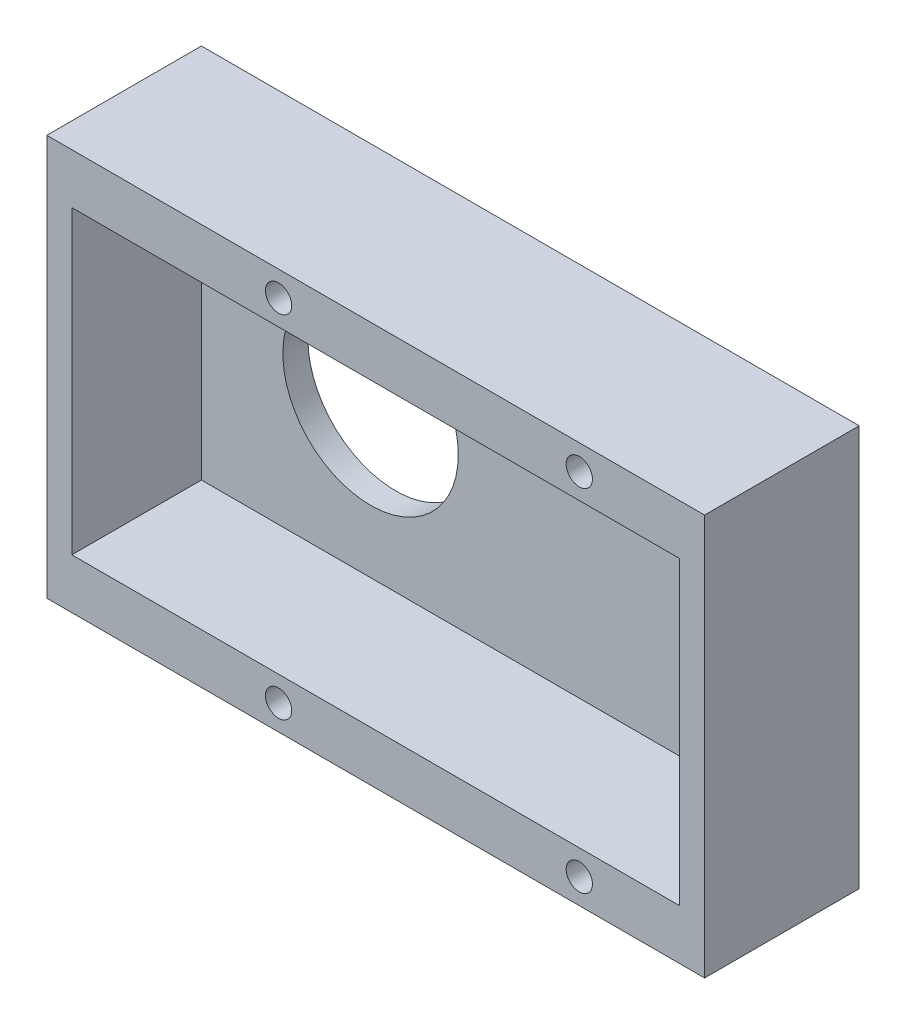
ISO-10303-21;
HEADER;
FILE_DESCRIPTION(('STEP AP214'),'2;1');
FILE_NAME('part.step','',(''),(''),'','','');
FILE_SCHEMA(('AUTOMOTIVE_DESIGN { 1 0 10303 214 1 1 1 1 }'));
ENDSEC;
DATA;
#1=APPLICATION_CONTEXT('core data for automotive mechanical design processes');
#2=APPLICATION_PROTOCOL_DEFINITION('international standard','automotive_design',2000,#1);
#3=PRODUCT_CONTEXT('',#1,'mechanical');
#4=PRODUCT('Part','Part','',(#3));
#5=PRODUCT_RELATED_PRODUCT_CATEGORY('part','',(#4));
#6=PRODUCT_DEFINITION_FORMATION('','',#4);
#7=PRODUCT_DEFINITION_CONTEXT('part definition',#1,'design');
#8=PRODUCT_DEFINITION('design','',#6,#7);
#9=PRODUCT_DEFINITION_SHAPE('','',#8);
#10=(LENGTH_UNIT() NAMED_UNIT(*) SI_UNIT(.MILLI.,.METRE.));
#11=(NAMED_UNIT(*) PLANE_ANGLE_UNIT() SI_UNIT($,.RADIAN.));
#12=(NAMED_UNIT(*) SI_UNIT($,.STERADIAN.) SOLID_ANGLE_UNIT());
#13=UNCERTAINTY_MEASURE_WITH_UNIT(LENGTH_MEASURE(1.E-05),#10,'distance_accuracy_value','');
#14=(GEOMETRIC_REPRESENTATION_CONTEXT(3) GLOBAL_UNCERTAINTY_ASSIGNED_CONTEXT((#13)) GLOBAL_UNIT_ASSIGNED_CONTEXT((#10,
#11,#12)) REPRESENTATION_CONTEXT('',''));
#15=CARTESIAN_POINT('',(0.,0.,0.));
#16=DIRECTION('',(0.,0.,1.));
#17=DIRECTION('',(1.,0.,0.));
#18=AXIS2_PLACEMENT_3D('',#15,#16,#17);
#19=CARTESIAN_POINT('',(0.,0.,2.));
#20=DIRECTION('',(1.,0.,0.));
#21=DIRECTION('',(0.,1.,0.));
#22=AXIS2_PLACEMENT_3D('',#19,#20,#21);
#23=PLANE('',#22);
#24=DIRECTION('',(0.,-1.,0.));
#25=VECTOR('',#24,1.);
#26=CARTESIAN_POINT('',(0.,0.,0.));
#27=LINE('',#26,#25);
#28=CARTESIAN_POINT('',(0.,32.,0.));
#29=VERTEX_POINT('',#28);
#30=CARTESIAN_POINT('',(0.,0.,0.));
#31=VERTEX_POINT('',#30);
#32=EDGE_CURVE('E158',#29,#31,#27,.T.);
#33=ORIENTED_EDGE('',*,*,#32,.T.);
#34=DIRECTION('',(0.,0.,-1.));
#35=VECTOR('',#34,1.);
#36=CARTESIAN_POINT('',(0.,0.,2.));
#37=LINE('',#36,#35);
#38=CARTESIAN_POINT('',(0.,0.,12.34));
#39=VERTEX_POINT('',#38);
#40=EDGE_CURVE('E11',#39,#31,#37,.T.);
#41=ORIENTED_EDGE('',*,*,#40,.F.);
#42=DIRECTION('',(0.,-1.,0.));
#43=VECTOR('',#42,1.);
#44=CARTESIAN_POINT('',(0.,32.,12.34));
#45=LINE('',#44,#43);
#46=CARTESIAN_POINT('',(0.,32.,12.34));
#47=VERTEX_POINT('',#46);
#48=EDGE_CURVE('E121',#47,#39,#45,.T.);
#49=ORIENTED_EDGE('',*,*,#48,.F.);
#50=DIRECTION('',(0.,0.,-1.));
#51=VECTOR('',#50,1.);
#52=CARTESIAN_POINT('',(0.,32.,2.));
#53=LINE('',#52,#51);
#54=EDGE_CURVE('E166',#47,#29,#53,.T.);
#55=ORIENTED_EDGE('',*,*,#54,.T.);
#56=EDGE_LOOP('',(#33,#41,#49,#55));
#57=FACE_BOUND('',#56,.T.);
#58=ADVANCED_FACE('F39',(#57),#23,.F.);
#59=CARTESIAN_POINT('',(0.,0.,2.));
#60=DIRECTION('',(0.,1.,0.));
#61=DIRECTION('',(0.,0.,1.));
#62=AXIS2_PLACEMENT_3D('',#59,#60,#61);
#63=PLANE('',#62);
#64=DIRECTION('',(1.,0.,0.));
#65=VECTOR('',#64,1.);
#66=CARTESIAN_POINT('',(0.,0.,0.));
#67=LINE('',#66,#65);
#68=CARTESIAN_POINT('',(52.5,0.,0.));
#69=VERTEX_POINT('',#68);
#70=EDGE_CURVE('E161',#31,#69,#67,.T.);
#71=ORIENTED_EDGE('',*,*,#70,.T.);
#72=DIRECTION('',(0.,0.,-1.));
#73=VECTOR('',#72,1.);
#74=CARTESIAN_POINT('',(52.5,0.,2.));
#75=LINE('',#74,#73);
#76=CARTESIAN_POINT('',(52.5,0.,12.34));
#77=VERTEX_POINT('',#76);
#78=EDGE_CURVE('E46',#77,#69,#75,.T.);
#79=ORIENTED_EDGE('',*,*,#78,.F.);
#80=DIRECTION('',(1.,0.,0.));
#81=VECTOR('',#80,1.);
#82=CARTESIAN_POINT('',(0.,0.,12.34));
#83=LINE('',#82,#81);
#84=EDGE_CURVE('E149',#39,#77,#83,.T.);
#85=ORIENTED_EDGE('',*,*,#84,.F.);
#86=ORIENTED_EDGE('',*,*,#40,.T.);
#87=EDGE_LOOP('',(#71,#79,#85,#86));
#88=FACE_BOUND('',#87,.T.);
#89=ADVANCED_FACE('F184',(#88),#63,.F.);
#90=CARTESIAN_POINT('',(52.5,0.,2.));
#91=DIRECTION('',(-1.,0.,0.));
#92=DIRECTION('',(0.,-1.,0.));
#93=AXIS2_PLACEMENT_3D('',#90,#91,#92);
#94=PLANE('',#93);
#95=DIRECTION('',(0.,1.,0.));
#96=VECTOR('',#95,1.);
#97=CARTESIAN_POINT('',(52.5,0.,0.));
#98=LINE('',#97,#96);
#99=CARTESIAN_POINT('',(52.5,32.,0.));
#100=VERTEX_POINT('',#99);
#101=EDGE_CURVE('E163',#69,#100,#98,.T.);
#102=ORIENTED_EDGE('',*,*,#101,.T.);
#103=DIRECTION('',(0.,0.,-1.));
#104=VECTOR('',#103,1.);
#105=CARTESIAN_POINT('',(52.5,32.,2.));
#106=LINE('',#105,#104);
#107=CARTESIAN_POINT('',(52.5,32.,12.34));
#108=VERTEX_POINT('',#107);
#109=EDGE_CURVE('E168',#108,#100,#106,.T.);
#110=ORIENTED_EDGE('',*,*,#109,.F.);
#111=DIRECTION('',(0.,1.,0.));
#112=VECTOR('',#111,1.);
#113=CARTESIAN_POINT('',(52.5,32.,12.34));
#114=LINE('',#113,#112);
#115=EDGE_CURVE('E152',#77,#108,#114,.T.);
#116=ORIENTED_EDGE('',*,*,#115,.F.);
#117=ORIENTED_EDGE('',*,*,#78,.T.);
#118=EDGE_LOOP('',(#102,#110,#116,#117));
#119=FACE_BOUND('',#118,.T.);
#120=ADVANCED_FACE('F173',(#119),#94,.F.);
#121=CARTESIAN_POINT('',(0.,32.,2.));
#122=DIRECTION('',(0.,-1.,0.));
#123=DIRECTION('',(0.,0.,-1.));
#124=AXIS2_PLACEMENT_3D('',#121,#122,#123);
#125=PLANE('',#124);
#126=DIRECTION('',(-1.,0.,0.));
#127=VECTOR('',#126,1.);
#128=CARTESIAN_POINT('',(0.,32.,0.));
#129=LINE('',#128,#127);
#130=EDGE_CURVE('E61',#100,#29,#129,.T.);
#131=ORIENTED_EDGE('',*,*,#130,.T.);
#132=ORIENTED_EDGE('',*,*,#54,.F.);
#133=DIRECTION('',(-1.,0.,0.));
#134=VECTOR('',#133,1.);
#135=CARTESIAN_POINT('',(0.,32.,12.34));
#136=LINE('',#135,#134);
#137=EDGE_CURVE('E155',#108,#47,#136,.T.);
#138=ORIENTED_EDGE('',*,*,#137,.F.);
#139=ORIENTED_EDGE('',*,*,#109,.T.);
#140=EDGE_LOOP('',(#131,#132,#138,#139));
#141=FACE_BOUND('',#140,.T.);
#142=ADVANCED_FACE('F182',(#141),#125,.F.);
#143=CARTESIAN_POINT('',(0.,0.,0.));
#144=DIRECTION('',(0.,0.,-1.));
#145=DIRECTION('',(-1.,0.,0.));
#146=AXIS2_PLACEMENT_3D('',#143,#144,#145);
#147=PLANE('',#146);
#148=CARTESIAN_POINT('',(18.5,2.,0.));
#149=DIRECTION('',(0.,0.,-1.));
#150=DIRECTION('',(-1.,0.,0.));
#151=AXIS2_PLACEMENT_3D('',#148,#149,#150);
#152=CIRCLE('',#151,1.05);
#153=CARTESIAN_POINT('',(17.45,2.,0.));
#154=VERTEX_POINT('',#153);
#155=EDGE_CURVE('E254',#154,#154,#152,.F.);
#156=ORIENTED_EDGE('',*,*,#155,.T.);
#157=EDGE_LOOP('',(#156));
#158=FACE_BOUND('',#157,.T.);
#159=CARTESIAN_POINT('',(42.5,1.99999999999999,0.));
#160=DIRECTION('',(0.,0.,-1.));
#161=DIRECTION('',(-1.,0.,0.));
#162=AXIS2_PLACEMENT_3D('',#159,#160,#161);
#163=CIRCLE('',#162,1.04999999999999);
#164=CARTESIAN_POINT('',(41.45,1.99999999999999,0.));
#165=VERTEX_POINT('',#164);
#166=EDGE_CURVE('E244',#165,#165,#163,.F.);
#167=ORIENTED_EDGE('',*,*,#166,.T.);
#168=EDGE_LOOP('',(#167));
#169=FACE_BOUND('',#168,.T.);
#170=CARTESIAN_POINT('',(42.5,30.,0.));
#171=DIRECTION('',(0.,0.,-1.));
#172=DIRECTION('',(-1.,0.,0.));
#173=AXIS2_PLACEMENT_3D('',#170,#171,#172);
#174=CIRCLE('',#173,1.04999999999999);
#175=CARTESIAN_POINT('',(41.45,30.,0.));
#176=VERTEX_POINT('',#175);
#177=EDGE_CURVE('E239',#176,#176,#174,.F.);
#178=ORIENTED_EDGE('',*,*,#177,.T.);
#179=EDGE_LOOP('',(#178));
#180=FACE_BOUND('',#179,.T.);
#181=CARTESIAN_POINT('',(18.5,30.,0.));
#182=DIRECTION('',(0.,0.,-1.));
#183=DIRECTION('',(-1.,0.,0.));
#184=AXIS2_PLACEMENT_3D('',#181,#182,#183);
#185=CIRCLE('',#184,1.05);
#186=CARTESIAN_POINT('',(17.45,30.,0.));
#187=VERTEX_POINT('',#186);
#188=EDGE_CURVE('E246',#187,#187,#185,.F.);
#189=ORIENTED_EDGE('',*,*,#188,.T.);
#190=EDGE_LOOP('',(#189));
#191=FACE_BOUND('',#190,.T.);
#192=CARTESIAN_POINT('',(15.5,16.,0.));
#193=DIRECTION('',(0.,0.,-1.));
#194=DIRECTION('',(-1.,0.,0.));
#195=AXIS2_PLACEMENT_3D('',#192,#193,#194);
#196=CIRCLE('',#195,7.00000000000001);
#197=CARTESIAN_POINT('',(8.5,16.,0.));
#198=VERTEX_POINT('',#197);
#199=EDGE_CURVE('E263',#198,#198,#196,.F.);
#200=ORIENTED_EDGE('',*,*,#199,.T.);
#201=EDGE_LOOP('',(#200));
#202=FACE_BOUND('',#201,.T.);
#203=ORIENTED_EDGE('',*,*,#32,.F.);
#204=ORIENTED_EDGE('',*,*,#130,.F.);
#205=ORIENTED_EDGE('',*,*,#101,.F.);
#206=ORIENTED_EDGE('',*,*,#70,.F.);
#207=EDGE_LOOP('',(#203,#204,#205,#206));
#208=FACE_BOUND('',#207,.T.);
#209=ADVANCED_FACE('F178',(#158,#169,#180,#191,#202,#208),#147,.T.);
#210=CARTESIAN_POINT('',(0.,0.,12.34));
#211=DIRECTION('',(0.,0.,1.));
#212=DIRECTION('',(1.,0.,0.));
#213=AXIS2_PLACEMENT_3D('',#210,#211,#212);
#214=PLANE('',#213);
#215=CARTESIAN_POINT('',(18.5,2.,12.34));
#216=DIRECTION('',(0.,0.,1.));
#217=DIRECTION('',(-1.,0.,0.));
#218=AXIS2_PLACEMENT_3D('',#215,#216,#217);
#219=CIRCLE('',#218,1.05);
#220=CARTESIAN_POINT('',(17.45,2.,12.34));
#221=VERTEX_POINT('',#220);
#222=EDGE_CURVE('E257',#221,#221,#219,.T.);
#223=ORIENTED_EDGE('',*,*,#222,.F.);
#224=EDGE_LOOP('',(#223));
#225=FACE_BOUND('',#224,.T.);
#226=CARTESIAN_POINT('',(42.5,1.99999999999999,12.34));
#227=DIRECTION('',(0.,0.,1.));
#228=DIRECTION('',(1.,0.,0.));
#229=AXIS2_PLACEMENT_3D('',#226,#227,#228);
#230=CIRCLE('',#229,1.04999999999999);
#231=CARTESIAN_POINT('',(43.55,1.99999999999999,12.34));
#232=VERTEX_POINT('',#231);
#233=EDGE_CURVE('E249',#232,#232,#230,.T.);
#234=ORIENTED_EDGE('',*,*,#233,.F.);
#235=EDGE_LOOP('',(#234));
#236=FACE_BOUND('',#235,.T.);
#237=CARTESIAN_POINT('',(42.5,30.,12.34));
#238=DIRECTION('',(0.,0.,1.));
#239=DIRECTION('',(-1.,0.,0.));
#240=AXIS2_PLACEMENT_3D('',#237,#238,#239);
#241=CIRCLE('',#240,1.04999999999999);
#242=CARTESIAN_POINT('',(41.45,30.,12.34));
#243=VERTEX_POINT('',#242);
#244=EDGE_CURVE('E242',#243,#243,#241,.T.);
#245=ORIENTED_EDGE('',*,*,#244,.F.);
#246=EDGE_LOOP('',(#245));
#247=FACE_BOUND('',#246,.T.);
#248=CARTESIAN_POINT('',(18.5,30.,12.34));
#249=DIRECTION('',(0.,0.,1.));
#250=DIRECTION('',(1.,0.,0.));
#251=AXIS2_PLACEMENT_3D('',#248,#249,#250);
#252=CIRCLE('',#251,1.05);
#253=CARTESIAN_POINT('',(19.55,30.,12.34));
#254=VERTEX_POINT('',#253);
#255=EDGE_CURVE('E260',#254,#254,#252,.T.);
#256=ORIENTED_EDGE('',*,*,#255,.F.);
#257=EDGE_LOOP('',(#256));
#258=FACE_BOUND('',#257,.T.);
#259=ORIENTED_EDGE('',*,*,#48,.T.);
#260=ORIENTED_EDGE('',*,*,#84,.T.);
#261=ORIENTED_EDGE('',*,*,#115,.T.);
#262=ORIENTED_EDGE('',*,*,#137,.T.);
#263=EDGE_LOOP('',(#259,#260,#261,#262));
#264=FACE_BOUND('',#263,.T.);
#265=DIRECTION('',(1.,0.,0.));
#266=VECTOR('',#265,1.);
#267=CARTESIAN_POINT('',(2.,4.,12.34));
#268=LINE('',#267,#266);
#269=CARTESIAN_POINT('',(2.,4.,12.34));
#270=VERTEX_POINT('',#269);
#271=CARTESIAN_POINT('',(50.5,4.,12.34));
#272=VERTEX_POINT('',#271);
#273=EDGE_CURVE('E113',#270,#272,#268,.T.);
#274=ORIENTED_EDGE('',*,*,#273,.F.);
#275=DIRECTION('',(0.,-1.,0.));
#276=VECTOR('',#275,1.);
#277=CARTESIAN_POINT('',(2.,28.,12.34));
#278=LINE('',#277,#276);
#279=CARTESIAN_POINT('',(2.,28.,12.34));
#280=VERTEX_POINT('',#279);
#281=EDGE_CURVE('E105',#280,#270,#278,.T.);
#282=ORIENTED_EDGE('',*,*,#281,.F.);
#283=DIRECTION('',(-1.,0.,0.));
#284=VECTOR('',#283,1.);
#285=CARTESIAN_POINT('',(2.,28.,12.34));
#286=LINE('',#285,#284);
#287=CARTESIAN_POINT('',(50.5,28.,12.34));
#288=VERTEX_POINT('',#287);
#289=EDGE_CURVE('E129',#288,#280,#286,.T.);
#290=ORIENTED_EDGE('',*,*,#289,.F.);
#291=DIRECTION('',(0.,1.,0.));
#292=VECTOR('',#291,1.);
#293=CARTESIAN_POINT('',(50.5,28.,12.34));
#294=LINE('',#293,#292);
#295=EDGE_CURVE('E127',#272,#288,#294,.T.);
#296=ORIENTED_EDGE('',*,*,#295,.F.);
#297=EDGE_LOOP('',(#274,#282,#290,#296));
#298=FACE_BOUND('',#297,.T.);
#299=ADVANCED_FACE('F125',(#225,#236,#247,#258,#264,#298),#214,.T.);
#300=CARTESIAN_POINT('',(2.,28.,12.34));
#301=DIRECTION('',(1.,0.,0.));
#302=DIRECTION('',(0.,1.,0.));
#303=AXIS2_PLACEMENT_3D('',#300,#301,#302);
#304=PLANE('',#303);
#305=DIRECTION('',(0.,-1.,0.));
#306=VECTOR('',#305,1.);
#307=CARTESIAN_POINT('',(2.,28.,2.));
#308=LINE('',#307,#306);
#309=CARTESIAN_POINT('',(2.,28.,2.));
#310=VERTEX_POINT('',#309);
#311=CARTESIAN_POINT('',(2.,4.,2.));
#312=VERTEX_POINT('',#311);
#313=EDGE_CURVE('E134',#310,#312,#308,.T.);
#314=ORIENTED_EDGE('',*,*,#313,.F.);
#315=DIRECTION('',(0.,0.,-1.));
#316=VECTOR('',#315,1.);
#317=CARTESIAN_POINT('',(2.,28.,12.34));
#318=LINE('',#317,#316);
#319=EDGE_CURVE('E53',#280,#310,#318,.T.);
#320=ORIENTED_EDGE('',*,*,#319,.F.);
#321=ORIENTED_EDGE('',*,*,#281,.T.);
#322=DIRECTION('',(0.,0.,-1.));
#323=VECTOR('',#322,1.);
#324=CARTESIAN_POINT('',(2.,4.,12.34));
#325=LINE('',#324,#323);
#326=EDGE_CURVE('E108',#270,#312,#325,.T.);
#327=ORIENTED_EDGE('',*,*,#326,.T.);
#328=EDGE_LOOP('',(#314,#320,#321,#327));
#329=FACE_BOUND('',#328,.T.);
#330=ADVANCED_FACE('F107',(#329),#304,.T.);
#331=CARTESIAN_POINT('',(2.,4.,12.34));
#332=DIRECTION('',(0.,1.,0.));
#333=DIRECTION('',(0.,0.,1.));
#334=AXIS2_PLACEMENT_3D('',#331,#332,#333);
#335=PLANE('',#334);
#336=DIRECTION('',(1.,0.,0.));
#337=VECTOR('',#336,1.);
#338=CARTESIAN_POINT('',(2.,4.,2.));
#339=LINE('',#338,#337);
#340=CARTESIAN_POINT('',(50.5,4.,2.));
#341=VERTEX_POINT('',#340);
#342=EDGE_CURVE('E120',#312,#341,#339,.T.);
#343=ORIENTED_EDGE('',*,*,#342,.F.);
#344=ORIENTED_EDGE('',*,*,#326,.F.);
#345=ORIENTED_EDGE('',*,*,#273,.T.);
#346=DIRECTION('',(0.,0.,-1.));
#347=VECTOR('',#346,1.);
#348=CARTESIAN_POINT('',(50.5,4.,12.34));
#349=LINE('',#348,#347);
#350=EDGE_CURVE('E122',#272,#341,#349,.T.);
#351=ORIENTED_EDGE('',*,*,#350,.T.);
#352=EDGE_LOOP('',(#343,#344,#345,#351));
#353=FACE_BOUND('',#352,.T.);
#354=ADVANCED_FACE('F117',(#353),#335,.T.);
#355=CARTESIAN_POINT('',(50.5,28.,12.34));
#356=DIRECTION('',(-1.,0.,0.));
#357=DIRECTION('',(0.,0.,1.));
#358=AXIS2_PLACEMENT_3D('',#355,#356,#357);
#359=PLANE('',#358);
#360=DIRECTION('',(0.,1.,0.));
#361=VECTOR('',#360,1.);
#362=CARTESIAN_POINT('',(50.5,28.,2.));
#363=LINE('',#362,#361);
#364=CARTESIAN_POINT('',(50.5,28.,2.));
#365=VERTEX_POINT('',#364);
#366=EDGE_CURVE('E138',#341,#365,#363,.T.);
#367=ORIENTED_EDGE('',*,*,#366,.F.);
#368=ORIENTED_EDGE('',*,*,#350,.F.);
#369=ORIENTED_EDGE('',*,*,#295,.T.);
#370=DIRECTION('',(0.,0.,-1.));
#371=VECTOR('',#370,1.);
#372=CARTESIAN_POINT('',(50.5,28.,12.34));
#373=LINE('',#372,#371);
#374=EDGE_CURVE('E144',#288,#365,#373,.T.);
#375=ORIENTED_EDGE('',*,*,#374,.T.);
#376=EDGE_LOOP('',(#367,#368,#369,#375));
#377=FACE_BOUND('',#376,.T.);
#378=ADVANCED_FACE('F210',(#377),#359,.T.);
#379=CARTESIAN_POINT('',(2.,28.,12.34));
#380=DIRECTION('',(0.,-1.,0.));
#381=DIRECTION('',(0.,0.,-1.));
#382=AXIS2_PLACEMENT_3D('',#379,#380,#381);
#383=PLANE('',#382);
#384=DIRECTION('',(-1.,0.,0.));
#385=VECTOR('',#384,1.);
#386=CARTESIAN_POINT('',(2.,28.,2.));
#387=LINE('',#386,#385);
#388=EDGE_CURVE('E114',#365,#310,#387,.T.);
#389=ORIENTED_EDGE('',*,*,#388,.F.);
#390=ORIENTED_EDGE('',*,*,#374,.F.);
#391=ORIENTED_EDGE('',*,*,#289,.T.);
#392=ORIENTED_EDGE('',*,*,#319,.T.);
#393=EDGE_LOOP('',(#389,#390,#391,#392));
#394=FACE_BOUND('',#393,.T.);
#395=ADVANCED_FACE('F201',(#394),#383,.T.);
#396=CARTESIAN_POINT('',(0.,0.,2.));
#397=DIRECTION('',(0.,0.,-1.));
#398=DIRECTION('',(-1.,0.,0.));
#399=AXIS2_PLACEMENT_3D('',#396,#397,#398);
#400=PLANE('',#399);
#401=CARTESIAN_POINT('',(15.5,16.,2.));
#402=DIRECTION('',(0.,0.,1.));
#403=DIRECTION('',(1.,0.,0.));
#404=AXIS2_PLACEMENT_3D('',#401,#402,#403);
#405=CIRCLE('',#404,7.00000000000001);
#406=CARTESIAN_POINT('',(22.5,16.,2.));
#407=VERTEX_POINT('',#406);
#408=EDGE_CURVE('E136',#407,#407,#405,.T.);
#409=ORIENTED_EDGE('',*,*,#408,.F.);
#410=EDGE_LOOP('',(#409));
#411=FACE_BOUND('',#410,.T.);
#412=ORIENTED_EDGE('',*,*,#388,.T.);
#413=ORIENTED_EDGE('',*,*,#313,.T.);
#414=ORIENTED_EDGE('',*,*,#342,.T.);
#415=ORIENTED_EDGE('',*,*,#366,.T.);
#416=EDGE_LOOP('',(#412,#413,#414,#415));
#417=FACE_BOUND('',#416,.T.);
#418=ADVANCED_FACE('F197',(#411,#417),#400,.F.);
#419=CARTESIAN_POINT('',(15.5,16.,-0.00100000000000013));
#420=DIRECTION('',(0.,0.,1.));
#421=DIRECTION('',(1.,0.,0.));
#422=AXIS2_PLACEMENT_3D('',#419,#420,#421);
#423=CYLINDRICAL_SURFACE('',#422,7.00000000000001);
#424=ORIENTED_EDGE('',*,*,#199,.F.);
#425=EDGE_LOOP('',(#424));
#426=FACE_BOUND('',#425,.T.);
#427=ORIENTED_EDGE('',*,*,#408,.T.);
#428=EDGE_LOOP('',(#427));
#429=FACE_BOUND('',#428,.T.);
#430=ADVANCED_FACE('F200',(#426,#429),#423,.F.);
#431=CARTESIAN_POINT('',(18.5,30.,-0.000999999999999265));
#432=DIRECTION('',(0.,0.,1.));
#433=DIRECTION('',(1.,0.,0.));
#434=AXIS2_PLACEMENT_3D('',#431,#432,#433);
#435=CYLINDRICAL_SURFACE('',#434,1.05);
#436=ORIENTED_EDGE('',*,*,#188,.F.);
#437=EDGE_LOOP('',(#436));
#438=FACE_BOUND('',#437,.T.);
#439=ORIENTED_EDGE('',*,*,#255,.T.);
#440=EDGE_LOOP('',(#439));
#441=FACE_BOUND('',#440,.T.);
#442=ADVANCED_FACE('F218',(#438,#441),#435,.F.);
#443=CARTESIAN_POINT('',(42.5,30.,-0.000999999999999265));
#444=DIRECTION('',(0.,0.,1.));
#445=DIRECTION('',(1.,0.,0.));
#446=AXIS2_PLACEMENT_3D('',#443,#444,#445);
#447=CYLINDRICAL_SURFACE('',#446,1.04999999999999);
#448=ORIENTED_EDGE('',*,*,#177,.F.);
#449=EDGE_LOOP('',(#448));
#450=FACE_BOUND('',#449,.T.);
#451=ORIENTED_EDGE('',*,*,#244,.T.);
#452=EDGE_LOOP('',(#451));
#453=FACE_BOUND('',#452,.T.);
#454=ADVANCED_FACE('F222',(#450,#453),#447,.F.);
#455=CARTESIAN_POINT('',(42.5,1.99999999999999,-0.000999999999999265));
#456=DIRECTION('',(0.,0.,1.));
#457=DIRECTION('',(1.,0.,0.));
#458=AXIS2_PLACEMENT_3D('',#455,#456,#457);
#459=CYLINDRICAL_SURFACE('',#458,1.04999999999999);
#460=ORIENTED_EDGE('',*,*,#166,.F.);
#461=EDGE_LOOP('',(#460));
#462=FACE_BOUND('',#461,.T.);
#463=ORIENTED_EDGE('',*,*,#233,.T.);
#464=EDGE_LOOP('',(#463));
#465=FACE_BOUND('',#464,.T.);
#466=ADVANCED_FACE('F227',(#462,#465),#459,.F.);
#467=CARTESIAN_POINT('',(18.5,2.,-0.000999999999999265));
#468=DIRECTION('',(0.,0.,1.));
#469=DIRECTION('',(1.,0.,0.));
#470=AXIS2_PLACEMENT_3D('',#467,#468,#469);
#471=CYLINDRICAL_SURFACE('',#470,1.05);
#472=ORIENTED_EDGE('',*,*,#155,.F.);
#473=EDGE_LOOP('',(#472));
#474=FACE_BOUND('',#473,.T.);
#475=ORIENTED_EDGE('',*,*,#222,.T.);
#476=EDGE_LOOP('',(#475));
#477=FACE_BOUND('',#476,.T.);
#478=ADVANCED_FACE('F224',(#474,#477),#471,.F.);
#479=CLOSED_SHELL('',(#58,#89,#120,#142,#209,#299,#330,#354,#378,#395,#418,#430,#442,#454,#466,#478));
#480=MANIFOLD_SOLID_BREP('B2',#479);
#481=ADVANCED_BREP_SHAPE_REPRESENTATION('',(#18,#480),#14);
#482=SHAPE_DEFINITION_REPRESENTATION(#9,#481);
ENDSEC;
END-ISO-10303-21;
